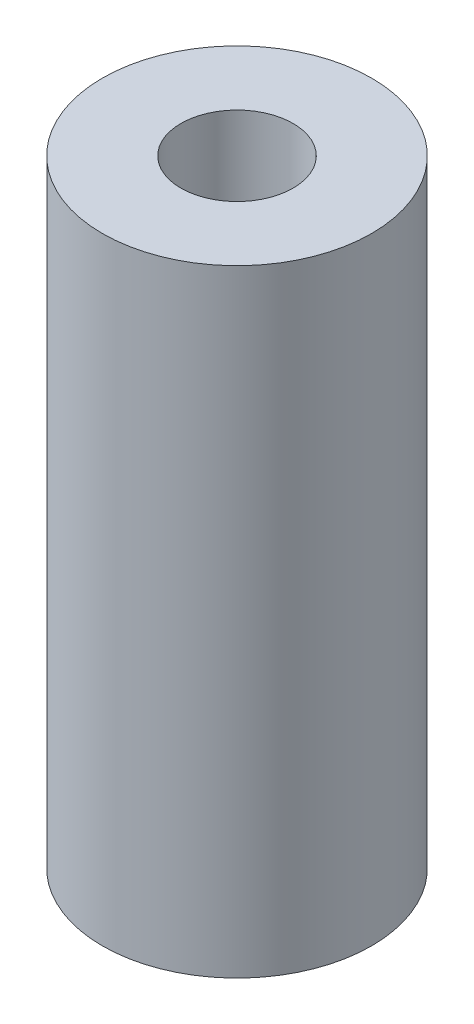
ISO-10303-21;
HEADER;
FILE_DESCRIPTION(('STEP AP214'),'2;1');
FILE_NAME('part.step','',(''),(''),'','','');
FILE_SCHEMA(('AUTOMOTIVE_DESIGN { 1 0 10303 214 1 1 1 1 }'));
ENDSEC;
DATA;
#1=APPLICATION_CONTEXT('core data for automotive mechanical design processes');
#2=APPLICATION_PROTOCOL_DEFINITION('international standard','automotive_design',2000,#1);
#3=PRODUCT_CONTEXT('',#1,'mechanical');
#4=PRODUCT('Part','Part','',(#3));
#5=PRODUCT_RELATED_PRODUCT_CATEGORY('part','',(#4));
#6=PRODUCT_DEFINITION_FORMATION('','',#4);
#7=PRODUCT_DEFINITION_CONTEXT('part definition',#1,'design');
#8=PRODUCT_DEFINITION('design','',#6,#7);
#9=PRODUCT_DEFINITION_SHAPE('','',#8);
#10=(LENGTH_UNIT() NAMED_UNIT(*) SI_UNIT(.MILLI.,.METRE.));
#11=(NAMED_UNIT(*) PLANE_ANGLE_UNIT() SI_UNIT($,.RADIAN.));
#12=(NAMED_UNIT(*) SI_UNIT($,.STERADIAN.) SOLID_ANGLE_UNIT());
#13=UNCERTAINTY_MEASURE_WITH_UNIT(LENGTH_MEASURE(1.E-05),#10,'distance_accuracy_value','');
#14=(GEOMETRIC_REPRESENTATION_CONTEXT(3) GLOBAL_UNCERTAINTY_ASSIGNED_CONTEXT((#13)) GLOBAL_UNIT_ASSIGNED_CONTEXT((#10,
#11,#12)) REPRESENTATION_CONTEXT('',''));
#15=CARTESIAN_POINT('',(0.,0.,0.));
#16=DIRECTION('',(0.,0.,1.));
#17=DIRECTION('',(1.,0.,0.));
#18=AXIS2_PLACEMENT_3D('',#15,#16,#17);
#19=CARTESIAN_POINT('',(0.,27.5,0.));
#20=DIRECTION('',(0.,1.,0.));
#21=DIRECTION('',(0.,0.,1.));
#22=AXIS2_PLACEMENT_3D('',#19,#20,#21);
#23=PLANE('',#22);
#24=CARTESIAN_POINT('',(0.,27.5,0.));
#25=DIRECTION('',(0.,1.,0.));
#26=DIRECTION('',(0.,0.,1.));
#27=AXIS2_PLACEMENT_3D('',#24,#25,#26);
#28=CIRCLE('',#27,6.);
#29=CARTESIAN_POINT('',(0.,27.5,6.));
#30=VERTEX_POINT('',#29);
#31=EDGE_CURVE('E10',#30,#30,#28,.T.);
#32=ORIENTED_EDGE('',*,*,#31,.T.);
#33=EDGE_LOOP('',(#32));
#34=FACE_BOUND('',#33,.T.);
#35=CARTESIAN_POINT('',(0.,27.5,0.));
#36=DIRECTION('',(0.,1.,0.));
#37=DIRECTION('',(0.,0.,1.));
#38=AXIS2_PLACEMENT_3D('',#35,#36,#37);
#39=CIRCLE('',#38,2.5);
#40=CARTESIAN_POINT('',(0.,27.5,2.5));
#41=VERTEX_POINT('',#40);
#42=EDGE_CURVE('E40',#41,#41,#39,.T.);
#43=ORIENTED_EDGE('',*,*,#42,.F.);
#44=EDGE_LOOP('',(#43));
#45=FACE_BOUND('',#44,.T.);
#46=ADVANCED_FACE('F29',(#34,#45),#23,.T.);
#47=CARTESIAN_POINT('',(0.,0.,0.));
#48=DIRECTION('',(0.,1.,0.));
#49=DIRECTION('',(0.,0.,1.));
#50=AXIS2_PLACEMENT_3D('',#47,#48,#49);
#51=PLANE('',#50);
#52=CARTESIAN_POINT('',(0.,0.,0.));
#53=DIRECTION('',(0.,1.,0.));
#54=DIRECTION('',(0.,0.,1.));
#55=AXIS2_PLACEMENT_3D('',#52,#53,#54);
#56=CIRCLE('',#55,6.);
#57=CARTESIAN_POINT('',(0.,0.,6.));
#58=VERTEX_POINT('',#57);
#59=EDGE_CURVE('E33',#58,#58,#56,.T.);
#60=ORIENTED_EDGE('',*,*,#59,.F.);
#61=EDGE_LOOP('',(#60));
#62=FACE_BOUND('',#61,.T.);
#63=CARTESIAN_POINT('',(0.,0.,0.));
#64=DIRECTION('',(0.,1.,0.));
#65=DIRECTION('',(0.,0.,1.));
#66=AXIS2_PLACEMENT_3D('',#63,#64,#65);
#67=CIRCLE('',#66,2.5);
#68=CARTESIAN_POINT('',(0.,0.,2.5));
#69=VERTEX_POINT('',#68);
#70=EDGE_CURVE('E42',#69,#69,#67,.T.);
#71=ORIENTED_EDGE('',*,*,#70,.T.);
#72=EDGE_LOOP('',(#71));
#73=FACE_BOUND('',#72,.T.);
#74=ADVANCED_FACE('F52',(#62,#73),#51,.F.);
#75=CARTESIAN_POINT('',(0.,27.5,0.));
#76=DIRECTION('',(0.,-1.,0.));
#77=DIRECTION('',(0.,0.,-1.));
#78=AXIS2_PLACEMENT_3D('',#75,#76,#77);
#79=CYLINDRICAL_SURFACE('',#78,6.);
#80=ORIENTED_EDGE('',*,*,#31,.F.);
#81=EDGE_LOOP('',(#80));
#82=FACE_BOUND('',#81,.T.);
#83=ORIENTED_EDGE('',*,*,#59,.T.);
#84=EDGE_LOOP('',(#83));
#85=FACE_BOUND('',#84,.T.);
#86=ADVANCED_FACE('F31',(#82,#85),#79,.T.);
#87=CARTESIAN_POINT('',(0.,27.5,0.));
#88=DIRECTION('',(0.,-1.,0.));
#89=DIRECTION('',(0.,0.,-1.));
#90=AXIS2_PLACEMENT_3D('',#87,#88,#89);
#91=CYLINDRICAL_SURFACE('',#90,2.5);
#92=ORIENTED_EDGE('',*,*,#42,.T.);
#93=EDGE_LOOP('',(#92));
#94=FACE_BOUND('',#93,.T.);
#95=ORIENTED_EDGE('',*,*,#70,.F.);
#96=EDGE_LOOP('',(#95));
#97=FACE_BOUND('',#96,.T.);
#98=ADVANCED_FACE('F48',(#94,#97),#91,.F.);
#99=CLOSED_SHELL('',(#46,#74,#86,#98));
#100=MANIFOLD_SOLID_BREP('B2',#99);
#101=ADVANCED_BREP_SHAPE_REPRESENTATION('',(#18,#100),#14);
#102=SHAPE_DEFINITION_REPRESENTATION(#9,#101);
ENDSEC;
END-ISO-10303-21;
